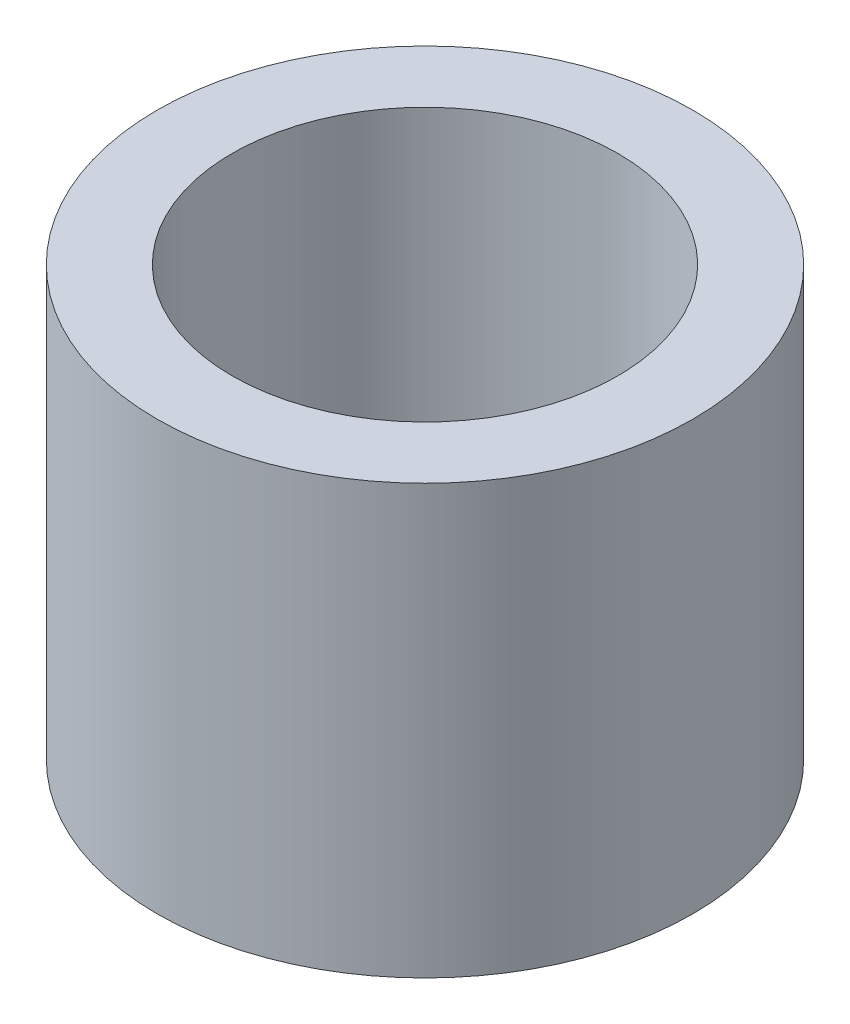
ISO-10303-21;
HEADER;
FILE_DESCRIPTION(('STEP AP214'),'2;1');
FILE_NAME('part.step','',(''),(''),'','','');
FILE_SCHEMA(('AUTOMOTIVE_DESIGN { 1 0 10303 214 1 1 1 1 }'));
ENDSEC;
DATA;
#1=APPLICATION_CONTEXT('core data for automotive mechanical design processes');
#2=APPLICATION_PROTOCOL_DEFINITION('international standard','automotive_design',2000,#1);
#3=PRODUCT_CONTEXT('',#1,'mechanical');
#4=PRODUCT('Part','Part','',(#3));
#5=PRODUCT_RELATED_PRODUCT_CATEGORY('part','',(#4));
#6=PRODUCT_DEFINITION_FORMATION('','',#4);
#7=PRODUCT_DEFINITION_CONTEXT('part definition',#1,'design');
#8=PRODUCT_DEFINITION('design','',#6,#7);
#9=PRODUCT_DEFINITION_SHAPE('','',#8);
#10=(LENGTH_UNIT() NAMED_UNIT(*) SI_UNIT(.MILLI.,.METRE.));
#11=(NAMED_UNIT(*) PLANE_ANGLE_UNIT() SI_UNIT($,.RADIAN.));
#12=(NAMED_UNIT(*) SI_UNIT($,.STERADIAN.) SOLID_ANGLE_UNIT());
#13=UNCERTAINTY_MEASURE_WITH_UNIT(LENGTH_MEASURE(1.E-05),#10,'distance_accuracy_value','');
#14=(GEOMETRIC_REPRESENTATION_CONTEXT(3) GLOBAL_UNCERTAINTY_ASSIGNED_CONTEXT((#13)) GLOBAL_UNIT_ASSIGNED_CONTEXT((#10,
#11,#12)) REPRESENTATION_CONTEXT('',''));
#15=CARTESIAN_POINT('',(0.,0.,0.));
#16=DIRECTION('',(0.,0.,1.));
#17=DIRECTION('',(1.,0.,0.));
#18=AXIS2_PLACEMENT_3D('',#15,#16,#17);
#19=CARTESIAN_POINT('',(0.,5.08,0.));
#20=DIRECTION('',(0.,-1.,0.));
#21=DIRECTION('',(0.,0.,-1.));
#22=AXIS2_PLACEMENT_3D('',#19,#20,#21);
#23=CYLINDRICAL_SURFACE('',#22,3.175);
#24=CARTESIAN_POINT('',(0.,5.08,0.));
#25=DIRECTION('',(0.,1.,0.));
#26=DIRECTION('',(0.,0.,1.));
#27=AXIS2_PLACEMENT_3D('',#24,#25,#26);
#28=CIRCLE('',#27,3.175);
#29=CARTESIAN_POINT('',(0.,5.08,3.175));
#30=VERTEX_POINT('',#29);
#31=EDGE_CURVE('E10',#30,#30,#28,.T.);
#32=ORIENTED_EDGE('',*,*,#31,.F.);
#33=EDGE_LOOP('',(#32));
#34=FACE_BOUND('',#33,.T.);
#35=CARTESIAN_POINT('',(0.,0.,0.));
#36=DIRECTION('',(0.,1.,0.));
#37=DIRECTION('',(0.,0.,1.));
#38=AXIS2_PLACEMENT_3D('',#35,#36,#37);
#39=CIRCLE('',#38,3.175);
#40=CARTESIAN_POINT('',(0.,0.,3.175));
#41=VERTEX_POINT('',#40);
#42=EDGE_CURVE('E41',#41,#41,#39,.T.);
#43=ORIENTED_EDGE('',*,*,#42,.T.);
#44=EDGE_LOOP('',(#43));
#45=FACE_BOUND('',#44,.T.);
#46=ADVANCED_FACE('F38',(#34,#45),#23,.T.);
#47=CARTESIAN_POINT('',(0.,5.08,0.));
#48=DIRECTION('',(0.,1.,0.));
#49=DIRECTION('',(0.,0.,1.));
#50=AXIS2_PLACEMENT_3D('',#47,#48,#49);
#51=PLANE('',#50);
#52=CARTESIAN_POINT('',(0.,5.08,0.));
#53=DIRECTION('',(0.,-1.,0.));
#54=DIRECTION('',(0.,0.,-1.));
#55=AXIS2_PLACEMENT_3D('',#52,#53,#54);
#56=CIRCLE('',#55,2.286);
#57=CARTESIAN_POINT('',(0.,5.08,-2.286));
#58=VERTEX_POINT('',#57);
#59=EDGE_CURVE('E48',#58,#58,#56,.T.);
#60=ORIENTED_EDGE('',*,*,#59,.T.);
#61=EDGE_LOOP('',(#60));
#62=FACE_BOUND('',#61,.T.);
#63=ORIENTED_EDGE('',*,*,#31,.T.);
#64=EDGE_LOOP('',(#63));
#65=FACE_BOUND('',#64,.T.);
#66=ADVANCED_FACE('F56',(#62,#65),#51,.T.);
#67=CARTESIAN_POINT('',(0.,0.,0.));
#68=DIRECTION('',(0.,1.,0.));
#69=DIRECTION('',(0.,0.,1.));
#70=AXIS2_PLACEMENT_3D('',#67,#68,#69);
#71=PLANE('',#70);
#72=CARTESIAN_POINT('',(0.,0.,0.));
#73=DIRECTION('',(0.,-1.,0.));
#74=DIRECTION('',(0.,0.,-1.));
#75=AXIS2_PLACEMENT_3D('',#72,#73,#74);
#76=CIRCLE('',#75,2.286);
#77=CARTESIAN_POINT('',(0.,0.,-2.286));
#78=VERTEX_POINT('',#77);
#79=EDGE_CURVE('E50',#78,#78,#76,.T.);
#80=ORIENTED_EDGE('',*,*,#79,.F.);
#81=EDGE_LOOP('',(#80));
#82=FACE_BOUND('',#81,.T.);
#83=ORIENTED_EDGE('',*,*,#42,.F.);
#84=EDGE_LOOP('',(#83));
#85=FACE_BOUND('',#84,.T.);
#86=ADVANCED_FACE('F61',(#82,#85),#71,.F.);
#87=CARTESIAN_POINT('',(0.,5.08,0.));
#88=DIRECTION('',(0.,-1.,0.));
#89=DIRECTION('',(0.,0.,-1.));
#90=AXIS2_PLACEMENT_3D('',#87,#88,#89);
#91=CYLINDRICAL_SURFACE('',#90,2.286);
#92=ORIENTED_EDGE('',*,*,#59,.F.);
#93=EDGE_LOOP('',(#92));
#94=FACE_BOUND('',#93,.T.);
#95=ORIENTED_EDGE('',*,*,#79,.T.);
#96=EDGE_LOOP('',(#95));
#97=FACE_BOUND('',#96,.T.);
#98=ADVANCED_FACE('F58',(#94,#97),#91,.F.);
#99=CLOSED_SHELL('',(#46,#66,#86,#98));
#100=MANIFOLD_SOLID_BREP('B2',#99);
#101=ADVANCED_BREP_SHAPE_REPRESENTATION('',(#18,#100),#14);
#102=SHAPE_DEFINITION_REPRESENTATION(#9,#101);
ENDSEC;
END-ISO-10303-21;
